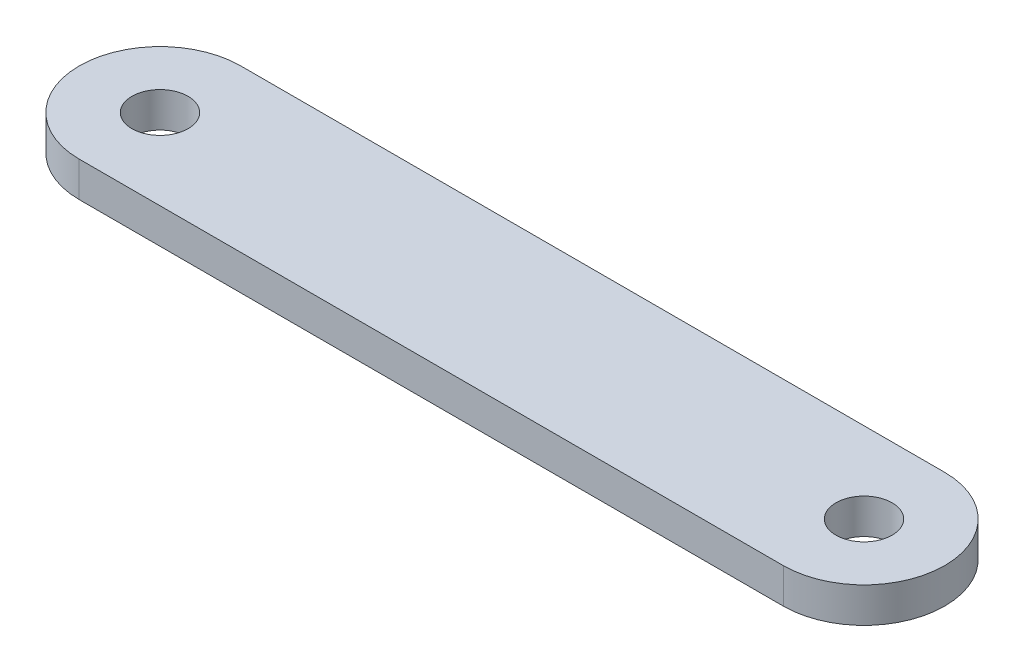
ISO-10303-21;
HEADER;
FILE_DESCRIPTION(('STEP AP214'),'2;1');
FILE_NAME('part.step','',(''),(''),'','','');
FILE_SCHEMA(('AUTOMOTIVE_DESIGN { 1 0 10303 214 1 1 1 1 }'));
ENDSEC;
DATA;
#1=APPLICATION_CONTEXT('core data for automotive mechanical design processes');
#2=APPLICATION_PROTOCOL_DEFINITION('international standard','automotive_design',2000,#1);
#3=PRODUCT_CONTEXT('',#1,'mechanical');
#4=PRODUCT('Part','Part','',(#3));
#5=PRODUCT_RELATED_PRODUCT_CATEGORY('part','',(#4));
#6=PRODUCT_DEFINITION_FORMATION('','',#4);
#7=PRODUCT_DEFINITION_CONTEXT('part definition',#1,'design');
#8=PRODUCT_DEFINITION('design','',#6,#7);
#9=PRODUCT_DEFINITION_SHAPE('','',#8);
#10=(LENGTH_UNIT() NAMED_UNIT(*) SI_UNIT(.MILLI.,.METRE.));
#11=(NAMED_UNIT(*) PLANE_ANGLE_UNIT() SI_UNIT($,.RADIAN.));
#12=(NAMED_UNIT(*) SI_UNIT($,.STERADIAN.) SOLID_ANGLE_UNIT());
#13=UNCERTAINTY_MEASURE_WITH_UNIT(LENGTH_MEASURE(1.E-05),#10,'distance_accuracy_value','');
#14=(GEOMETRIC_REPRESENTATION_CONTEXT(3) GLOBAL_UNCERTAINTY_ASSIGNED_CONTEXT((#13)) GLOBAL_UNIT_ASSIGNED_CONTEXT((#10,
#11,#12)) REPRESENTATION_CONTEXT('',''));
#15=CARTESIAN_POINT('',(0.,0.,0.));
#16=DIRECTION('',(0.,0.,1.));
#17=DIRECTION('',(1.,0.,0.));
#18=AXIS2_PLACEMENT_3D('',#15,#16,#17);
#19=CARTESIAN_POINT('',(0.,-2.,3.53053173200996));
#20=DIRECTION('',(0.,0.,1.));
#21=DIRECTION('',(1.,0.,0.));
#22=AXIS2_PLACEMENT_3D('',#19,#20,#21);
#23=PLANE('',#22);
#24=DIRECTION('',(1.,0.,0.));
#25=VECTOR('',#24,1.);
#26=CARTESIAN_POINT('',(0.,0.,3.53053173200996));
#27=LINE('',#26,#25);
#28=CARTESIAN_POINT('',(-9.49387620356075,0.,3.53053173200996));
#29=VERTEX_POINT('',#28);
#30=CARTESIAN_POINT('',(30.6161237964393,0.,3.53053173200996));
#31=VERTEX_POINT('',#30);
#32=EDGE_CURVE('E120',#29,#31,#27,.T.);
#33=ORIENTED_EDGE('',*,*,#32,.F.);
#34=DIRECTION('',(0.,1.,0.));
#35=VECTOR('',#34,1.);
#36=CARTESIAN_POINT('',(-9.49387620356075,-2.,3.53053173200996));
#37=LINE('',#36,#35);
#38=CARTESIAN_POINT('',(-9.49387620356075,-2.,3.53053173200996));
#39=VERTEX_POINT('',#38);
#40=EDGE_CURVE('E11',#39,#29,#37,.T.);
#41=ORIENTED_EDGE('',*,*,#40,.F.);
#42=DIRECTION('',(1.,0.,0.));
#43=VECTOR('',#42,1.);
#44=CARTESIAN_POINT('',(0.,-2.,3.53053173200996));
#45=LINE('',#44,#43);
#46=CARTESIAN_POINT('',(30.6161237964393,-2.,3.53053173200996));
#47=VERTEX_POINT('',#46);
#48=EDGE_CURVE('E104',#39,#47,#45,.T.);
#49=ORIENTED_EDGE('',*,*,#48,.T.);
#50=DIRECTION('',(0.,1.,0.));
#51=VECTOR('',#50,1.);
#52=CARTESIAN_POINT('',(30.6161237964393,-2.,3.53053173200996));
#53=LINE('',#52,#51);
#54=EDGE_CURVE('E44',#47,#31,#53,.T.);
#55=ORIENTED_EDGE('',*,*,#54,.T.);
#56=EDGE_LOOP('',(#33,#41,#49,#55));
#57=FACE_BOUND('',#56,.T.);
#58=ADVANCED_FACE('F41',(#57),#23,.T.);
#59=CARTESIAN_POINT('',(-9.49387620356075,-2.,-1.06946826799004));
#60=DIRECTION('',(0.,1.,0.));
#61=DIRECTION('',(0.,0.,1.));
#62=AXIS2_PLACEMENT_3D('',#59,#60,#61);
#63=CYLINDRICAL_SURFACE('',#62,4.6);
#64=CARTESIAN_POINT('',(-9.49387620356075,0.,-1.06946826799004));
#65=DIRECTION('',(0.,1.,0.));
#66=DIRECTION('',(0.,0.,1.));
#67=AXIS2_PLACEMENT_3D('',#64,#65,#66);
#68=CIRCLE('',#67,4.6);
#69=CARTESIAN_POINT('',(-9.49387620356075,0.,-5.66946826799005));
#70=VERTEX_POINT('',#69);
#71=EDGE_CURVE('E129',#70,#29,#68,.T.);
#72=ORIENTED_EDGE('',*,*,#71,.F.);
#73=DIRECTION('',(0.,1.,0.));
#74=VECTOR('',#73,1.);
#75=CARTESIAN_POINT('',(-9.49387620356075,-2.,-5.66946826799005));
#76=LINE('',#75,#74);
#77=CARTESIAN_POINT('',(-9.49387620356075,-2.,-5.66946826799005));
#78=VERTEX_POINT('',#77);
#79=EDGE_CURVE('E51',#78,#70,#76,.T.);
#80=ORIENTED_EDGE('',*,*,#79,.F.);
#81=CARTESIAN_POINT('',(-9.49387620356075,-2.,-1.06946826799004));
#82=DIRECTION('',(0.,1.,0.));
#83=DIRECTION('',(0.,0.,1.));
#84=AXIS2_PLACEMENT_3D('',#81,#82,#83);
#85=CIRCLE('',#84,4.6);
#86=EDGE_CURVE('E94',#78,#39,#85,.T.);
#87=ORIENTED_EDGE('',*,*,#86,.T.);
#88=ORIENTED_EDGE('',*,*,#40,.T.);
#89=EDGE_LOOP('',(#72,#80,#87,#88));
#90=FACE_BOUND('',#89,.T.);
#91=ADVANCED_FACE('F145',(#90),#63,.T.);
#92=CARTESIAN_POINT('',(0.,-2.,-5.66946826799005));
#93=DIRECTION('',(0.,0.,1.));
#94=DIRECTION('',(1.,0.,0.));
#95=AXIS2_PLACEMENT_3D('',#92,#93,#94);
#96=PLANE('',#95);
#97=DIRECTION('',(1.,0.,0.));
#98=VECTOR('',#97,1.);
#99=CARTESIAN_POINT('',(0.,0.,-5.66946826799005));
#100=LINE('',#99,#98);
#101=CARTESIAN_POINT('',(30.6161237964393,0.,-5.66946826799005));
#102=VERTEX_POINT('',#101);
#103=EDGE_CURVE('E99',#70,#102,#100,.T.);
#104=ORIENTED_EDGE('',*,*,#103,.T.);
#105=DIRECTION('',(0.,1.,0.));
#106=VECTOR('',#105,1.);
#107=CARTESIAN_POINT('',(30.6161237964393,-2.,-5.66946826799005));
#108=LINE('',#107,#106);
#109=CARTESIAN_POINT('',(30.6161237964393,-2.,-5.66946826799005));
#110=VERTEX_POINT('',#109);
#111=EDGE_CURVE('E97',#110,#102,#108,.T.);
#112=ORIENTED_EDGE('',*,*,#111,.F.);
#113=DIRECTION('',(1.,0.,0.));
#114=VECTOR('',#113,1.);
#115=CARTESIAN_POINT('',(0.,-2.,-5.66946826799005));
#116=LINE('',#115,#114);
#117=EDGE_CURVE('E89',#78,#110,#116,.T.);
#118=ORIENTED_EDGE('',*,*,#117,.F.);
#119=ORIENTED_EDGE('',*,*,#79,.T.);
#120=EDGE_LOOP('',(#104,#112,#118,#119));
#121=FACE_BOUND('',#120,.T.);
#122=ADVANCED_FACE('F98',(#121),#96,.F.);
#123=CARTESIAN_POINT('',(30.6161237964393,-2.,-1.06946826799004));
#124=DIRECTION('',(0.,1.,0.));
#125=DIRECTION('',(0.,0.,1.));
#126=AXIS2_PLACEMENT_3D('',#123,#124,#125);
#127=CYLINDRICAL_SURFACE('',#126,1.60000000000001);
#128=CARTESIAN_POINT('',(30.6161237964393,-2.,-1.06946826799004));
#129=DIRECTION('',(0.,1.,0.));
#130=DIRECTION('',(0.,0.,1.));
#131=AXIS2_PLACEMENT_3D('',#128,#129,#130);
#132=CIRCLE('',#131,1.60000000000001);
#133=CARTESIAN_POINT('',(30.6161237964393,-2.,0.530531732009961));
#134=VERTEX_POINT('',#133);
#135=EDGE_CURVE('E112',#134,#134,#132,.T.);
#136=ORIENTED_EDGE('',*,*,#135,.F.);
#137=EDGE_LOOP('',(#136));
#138=FACE_BOUND('',#137,.T.);
#139=CARTESIAN_POINT('',(30.6161237964393,0.,-1.06946826799004));
#140=DIRECTION('',(0.,1.,0.));
#141=DIRECTION('',(0.,0.,1.));
#142=AXIS2_PLACEMENT_3D('',#139,#140,#141);
#143=CIRCLE('',#142,1.60000000000001);
#144=CARTESIAN_POINT('',(30.6161237964393,0.,0.530531732009961));
#145=VERTEX_POINT('',#144);
#146=EDGE_CURVE('E133',#145,#145,#143,.T.);
#147=ORIENTED_EDGE('',*,*,#146,.T.);
#148=EDGE_LOOP('',(#147));
#149=FACE_BOUND('',#148,.T.);
#150=ADVANCED_FACE('F152',(#138,#149),#127,.F.);
#151=CARTESIAN_POINT('',(30.6161237964393,-2.,-1.06946826799004));
#152=DIRECTION('',(0.,1.,0.));
#153=DIRECTION('',(0.,0.,1.));
#154=AXIS2_PLACEMENT_3D('',#151,#152,#153);
#155=CYLINDRICAL_SURFACE('',#154,4.60000000000001);
#156=CARTESIAN_POINT('',(30.6161237964393,0.,-1.06946826799004));
#157=DIRECTION('',(0.,1.,0.));
#158=DIRECTION('',(0.,0.,1.));
#159=AXIS2_PLACEMENT_3D('',#156,#157,#158);
#160=CIRCLE('',#159,4.60000000000001);
#161=EDGE_CURVE('E124',#31,#102,#160,.T.);
#162=ORIENTED_EDGE('',*,*,#161,.F.);
#163=ORIENTED_EDGE('',*,*,#54,.F.);
#164=CARTESIAN_POINT('',(30.6161237964393,-2.,-1.06946826799004));
#165=DIRECTION('',(0.,1.,0.));
#166=DIRECTION('',(0.,0.,1.));
#167=AXIS2_PLACEMENT_3D('',#164,#165,#166);
#168=CIRCLE('',#167,4.60000000000001);
#169=EDGE_CURVE('E93',#47,#110,#168,.T.);
#170=ORIENTED_EDGE('',*,*,#169,.T.);
#171=ORIENTED_EDGE('',*,*,#111,.T.);
#172=EDGE_LOOP('',(#162,#163,#170,#171));
#173=FACE_BOUND('',#172,.T.);
#174=ADVANCED_FACE('F102',(#173),#155,.T.);
#175=CARTESIAN_POINT('',(-9.49387620356075,-2.,-1.06946826799004));
#176=DIRECTION('',(0.,1.,0.));
#177=DIRECTION('',(0.,0.,1.));
#178=AXIS2_PLACEMENT_3D('',#175,#176,#177);
#179=CYLINDRICAL_SURFACE('',#178,1.6);
#180=CARTESIAN_POINT('',(-9.49387620356075,-2.,-1.06946826799004));
#181=DIRECTION('',(0.,1.,0.));
#182=DIRECTION('',(0.,0.,1.));
#183=AXIS2_PLACEMENT_3D('',#180,#181,#182);
#184=CIRCLE('',#183,1.6);
#185=CARTESIAN_POINT('',(-9.49387620356075,-2.,0.530531732009956));
#186=VERTEX_POINT('',#185);
#187=EDGE_CURVE('E116',#186,#186,#184,.T.);
#188=ORIENTED_EDGE('',*,*,#187,.F.);
#189=EDGE_LOOP('',(#188));
#190=FACE_BOUND('',#189,.T.);
#191=CARTESIAN_POINT('',(-9.49387620356075,0.,-1.06946826799004));
#192=DIRECTION('',(0.,1.,0.));
#193=DIRECTION('',(0.,0.,1.));
#194=AXIS2_PLACEMENT_3D('',#191,#192,#193);
#195=CIRCLE('',#194,1.6);
#196=CARTESIAN_POINT('',(-9.49387620356075,0.,0.530531732009956));
#197=VERTEX_POINT('',#196);
#198=EDGE_CURVE('E107',#197,#197,#195,.T.);
#199=ORIENTED_EDGE('',*,*,#198,.T.);
#200=EDGE_LOOP('',(#199));
#201=FACE_BOUND('',#200,.T.);
#202=ADVANCED_FACE('F157',(#190,#201),#179,.F.);
#203=CARTESIAN_POINT('',(0.,-2.,0.));
#204=DIRECTION('',(0.,1.,0.));
#205=DIRECTION('',(0.,0.,1.));
#206=AXIS2_PLACEMENT_3D('',#203,#204,#205);
#207=PLANE('',#206);
#208=ORIENTED_EDGE('',*,*,#48,.F.);
#209=ORIENTED_EDGE('',*,*,#86,.F.);
#210=ORIENTED_EDGE('',*,*,#117,.T.);
#211=ORIENTED_EDGE('',*,*,#169,.F.);
#212=EDGE_LOOP('',(#208,#209,#210,#211));
#213=FACE_BOUND('',#212,.T.);
#214=ORIENTED_EDGE('',*,*,#135,.T.);
#215=EDGE_LOOP('',(#214));
#216=FACE_BOUND('',#215,.T.);
#217=ORIENTED_EDGE('',*,*,#187,.T.);
#218=EDGE_LOOP('',(#217));
#219=FACE_BOUND('',#218,.T.);
#220=ADVANCED_FACE('F91',(#213,#216,#219),#207,.F.);
#221=CARTESIAN_POINT('',(0.,0.,0.));
#222=DIRECTION('',(0.,1.,0.));
#223=DIRECTION('',(0.,0.,1.));
#224=AXIS2_PLACEMENT_3D('',#221,#222,#223);
#225=PLANE('',#224);
#226=ORIENTED_EDGE('',*,*,#32,.T.);
#227=ORIENTED_EDGE('',*,*,#161,.T.);
#228=ORIENTED_EDGE('',*,*,#103,.F.);
#229=ORIENTED_EDGE('',*,*,#71,.T.);
#230=EDGE_LOOP('',(#226,#227,#228,#229));
#231=FACE_BOUND('',#230,.T.);
#232=ORIENTED_EDGE('',*,*,#146,.F.);
#233=EDGE_LOOP('',(#232));
#234=FACE_BOUND('',#233,.T.);
#235=ORIENTED_EDGE('',*,*,#198,.F.);
#236=EDGE_LOOP('',(#235));
#237=FACE_BOUND('',#236,.T.);
#238=ADVANCED_FACE('F143',(#231,#234,#237),#225,.T.);
#239=CLOSED_SHELL('',(#58,#91,#122,#150,#174,#202,#220,#238));
#240=MANIFOLD_SOLID_BREP('B2',#239);
#241=ADVANCED_BREP_SHAPE_REPRESENTATION('',(#18,#240),#14);
#242=SHAPE_DEFINITION_REPRESENTATION(#9,#241);
ENDSEC;
END-ISO-10303-21;
